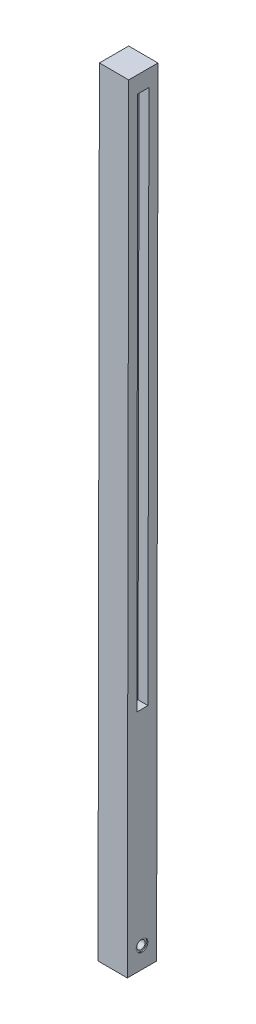
ISO-10303-21;
HEADER;
FILE_DESCRIPTION(('STEP AP214'),'2;1');
FILE_NAME('part.step','',(''),(''),'','','');
FILE_SCHEMA(('AUTOMOTIVE_DESIGN { 1 0 10303 214 1 1 1 1 }'));
ENDSEC;
DATA;
#1=APPLICATION_CONTEXT('core data for automotive mechanical design processes');
#2=APPLICATION_PROTOCOL_DEFINITION('international standard','automotive_design',2000,#1);
#3=PRODUCT_CONTEXT('',#1,'mechanical');
#4=PRODUCT('Part','Part','',(#3));
#5=PRODUCT_RELATED_PRODUCT_CATEGORY('part','',(#4));
#6=PRODUCT_DEFINITION_FORMATION('','',#4);
#7=PRODUCT_DEFINITION_CONTEXT('part definition',#1,'design');
#8=PRODUCT_DEFINITION('design','',#6,#7);
#9=PRODUCT_DEFINITION_SHAPE('','',#8);
#10=(LENGTH_UNIT() NAMED_UNIT(*) SI_UNIT(.MILLI.,.METRE.));
#11=(NAMED_UNIT(*) PLANE_ANGLE_UNIT() SI_UNIT($,.RADIAN.));
#12=(NAMED_UNIT(*) SI_UNIT($,.STERADIAN.) SOLID_ANGLE_UNIT());
#13=UNCERTAINTY_MEASURE_WITH_UNIT(LENGTH_MEASURE(1.E-05),#10,'distance_accuracy_value','');
#14=(GEOMETRIC_REPRESENTATION_CONTEXT(3) GLOBAL_UNCERTAINTY_ASSIGNED_CONTEXT((#13)) GLOBAL_UNIT_ASSIGNED_CONTEXT((#10,
#11,#12)) REPRESENTATION_CONTEXT('',''));
#15=CARTESIAN_POINT('',(0.,0.,0.));
#16=DIRECTION('',(0.,0.,1.));
#17=DIRECTION('',(1.,0.,0.));
#18=AXIS2_PLACEMENT_3D('',#15,#16,#17);
#19=CARTESIAN_POINT('',(24.3417149604156,31.7075640077742,0.));
#20=DIRECTION('',(-0.999998476913288,0.0017453283659014,0.));
#21=DIRECTION('',(-0.0017453283659014,-0.999998476913288,0.));
#22=AXIS2_PLACEMENT_3D('',#19,#20,#21);
#23=CYLINDRICAL_SURFACE('',#22,6.4135);
#24=CARTESIAN_POINT('',(-20.5820543916748,31.785970856148,0.));
#25=DIRECTION('',(-0.999998476913288,0.00174532836589819,0.));
#26=DIRECTION('',(-0.00174532836589819,-0.999998476913288,0.));
#27=AXIS2_PLACEMENT_3D('',#24,#25,#26);
#28=CIRCLE('',#27,6.4135);
#29=CARTESIAN_POINT('',(-20.5932480551494,25.3724806244647,0.));
#30=VERTEX_POINT('',#29);
#31=EDGE_CURVE('E165',#30,#30,#28,.T.);
#32=CARTESIAN_POINT('',(20.6928827429093,31.7139324278455,0.));
#33=DIRECTION('',(0.999998476913288,-0.0017453283658982,0.));
#34=DIRECTION('',(0.0017453283658982,0.999998476913288,0.));
#35=AXIS2_PLACEMENT_3D('',#32,#33,#34);
#36=CIRCLE('',#35,6.4135);
#37=CARTESIAN_POINT('',(20.6816890794346,25.3004421961621,0.));
#38=VERTEX_POINT('',#37);
#39=EDGE_CURVE('E43',#38,#38,#36,.T.);
#40=CARTESIAN_POINT('',(-20.5932480551494,25.3724806244647,0.));
#41=CARTESIAN_POINT('',(-20.1633007933309,25.3717302241698,0.));
#42=CARTESIAN_POINT('',(-19.7333535315123,25.370979823875,0.));
#43=CARTESIAN_POINT('',(-18.8734590078751,25.3694790232854,0.));
#44=CARTESIAN_POINT('',(-18.4435117460565,25.3687286229906,0.));
#45=CARTESIAN_POINT('',(-17.5836172224194,25.3672278224009,0.));
#46=CARTESIAN_POINT('',(-17.1536699606008,25.3664774221061,0.));
#47=CARTESIAN_POINT('',(-16.2937754369636,25.3649766215165,0.));
#48=CARTESIAN_POINT('',(-15.863828175145,25.3642262212216,0.));
#49=CARTESIAN_POINT('',(-15.0039336515079,25.362725420632,0.));
#50=CARTESIAN_POINT('',(-14.5739863896893,25.3619750203372,0.));
#51=CARTESIAN_POINT('',(-13.7140918660521,25.3604742197476,0.));
#52=CARTESIAN_POINT('',(-13.2841446042335,25.3597238194527,0.));
#53=CARTESIAN_POINT('',(-12.4242500805964,25.3582230188631,0.));
#54=CARTESIAN_POINT('',(-11.9943028187778,25.3574726185683,0.));
#55=CARTESIAN_POINT('',(-11.1344082951406,25.3559718179786,0.));
#56=CARTESIAN_POINT('',(-10.704461033322,25.3552214176838,0.));
#57=CARTESIAN_POINT('',(-9.84456650968485,25.3537206170942,0.));
#58=CARTESIAN_POINT('',(-9.41461924786627,25.3529702167994,0.));
#59=CARTESIAN_POINT('',(-8.5547247242291,25.3514694162097,0.));
#60=CARTESIAN_POINT('',(-8.12477746241052,25.3507190159149,0.));
#61=CARTESIAN_POINT('',(-7.26488293877335,25.3492182153253,0.));
#62=CARTESIAN_POINT('',(-6.83493567695476,25.3484678150305,0.));
#63=CARTESIAN_POINT('',(-5.9750411533176,25.3469670144408,0.));
#64=CARTESIAN_POINT('',(-5.54509389149901,25.346216614146,0.));
#65=CARTESIAN_POINT('',(-4.68519936786185,25.3447158135564,0.));
#66=CARTESIAN_POINT('',(-4.25525210604326,25.3439654132616,0.));
#67=CARTESIAN_POINT('',(-3.39535758240609,25.3424646126719,0.));
#68=CARTESIAN_POINT('',(-2.96541032058751,25.3417142123771,0.));
#69=CARTESIAN_POINT('',(-2.10551579695034,25.3402134117875,0.));
#70=CARTESIAN_POINT('',(-1.67556853513176,25.3394630114926,0.));
#71=CARTESIAN_POINT('',(-0.815674011494589,25.337962210903,0.));
#72=CARTESIAN_POINT('',(-0.385726749676005,25.3372118106082,0.));
#73=CARTESIAN_POINT('',(0.474167773961162,25.3357110100186,0.));
#74=CARTESIAN_POINT('',(0.904115035779745,25.3349606097237,0.));
#75=CARTESIAN_POINT('',(1.76400955941691,25.3334598091341,0.));
#76=CARTESIAN_POINT('',(2.1939568212355,25.3327094088393,0.));
#77=CARTESIAN_POINT('',(3.05385134487267,25.3312086082496,0.));
#78=CARTESIAN_POINT('',(3.48379860669125,25.3304582079548,0.));
#79=CARTESIAN_POINT('',(4.34369313032842,25.3289574073652,0.));
#80=CARTESIAN_POINT('',(4.773640392147,25.3282070070704,0.));
#81=CARTESIAN_POINT('',(5.63353491578417,25.3267062064807,0.));
#82=CARTESIAN_POINT('',(6.06348217760276,25.3259558061859,0.));
#83=CARTESIAN_POINT('',(6.92337670123992,25.3244550055963,0.));
#84=CARTESIAN_POINT('',(7.3533239630585,25.3237046053015,0.));
#85=CARTESIAN_POINT('',(8.21321848669567,25.3222038047118,0.));
#86=CARTESIAN_POINT('',(8.64316574851426,25.321453404417,0.));
#87=CARTESIAN_POINT('',(9.50306027215143,25.3199526038274,0.));
#88=CARTESIAN_POINT('',(9.93300753397001,25.3192022035326,0.));
#89=CARTESIAN_POINT('',(10.7929020576072,25.3177014029429,0.));
#90=CARTESIAN_POINT('',(11.2228493194258,25.3169510026481,0.));
#91=CARTESIAN_POINT('',(12.0827438430629,25.3154502020585,0.));
#92=CARTESIAN_POINT('',(12.5126911048815,25.3146998017636,0.));
#93=CARTESIAN_POINT('',(13.3725856285187,25.313199001174,0.));
#94=CARTESIAN_POINT('',(13.8025328903373,25.3124486008792,0.));
#95=CARTESIAN_POINT('',(14.6624274139744,25.3109478002895,0.));
#96=CARTESIAN_POINT('',(15.092374675793,25.3101973999947,0.));
#97=CARTESIAN_POINT('',(15.9522691994302,25.3086965994051,0.));
#98=CARTESIAN_POINT('',(16.3822164612488,25.3079461991103,0.));
#99=CARTESIAN_POINT('',(17.2421109848859,25.3064453985206,0.));
#100=CARTESIAN_POINT('',(17.6720582467045,25.3056949982258,0.));
#101=CARTESIAN_POINT('',(18.5319527703417,25.3041941976362,0.));
#102=CARTESIAN_POINT('',(18.9619000321603,25.3034437973414,0.));
#103=CARTESIAN_POINT('',(19.8217945557974,25.3019429967517,0.));
#104=CARTESIAN_POINT('',(20.251741817616,25.3011925964569,0.));
#105=CARTESIAN_POINT('',(20.6816890794346,25.3004421961621,0.));
#106=B_SPLINE_CURVE_WITH_KNOTS('',3,(#40,#41,#42,#43,#44,#45,#46,#47,#48,#49,#50,#51,#52,#53,
#54,#55,#56,#57,#58,#59,#60,#61,#62,#63,#64,#65,#66,#67,#68,#69,#70,#71,#72,#73,#74,#75,#76,#77,
#78,#79,#80,#81,#82,#83,#84,#85,#86,#87,#88,#89,#90,#91,#92,#93,#94,#95,#96,#97,#98,#99,#100,
#101,#102,#103,#104,#105),.UNSPECIFIED.,.F.,.F.,(4,2,2,2,2,2,2,2,2,2,2,2,2,2,2,2,2,2,2,2,2,2,2,
2,2,2,2,2,2,2,2,2,4),(0.,1.28984374999963,2.57968749999925,3.86953124999888,5.15937499999852,
6.44921874999813,7.73906249999777,9.0289062499974,10.318749999997,11.6085937499967,
12.8984374999963,14.1882812499959,15.4781249999955,16.7679687499952,18.0578124999948,
19.3476562499944,20.6374999999941,21.9273437499937,23.2171874999933,24.5070312499929,
25.7968749999926,27.0867187499922,28.3765624999918,29.6664062499914,30.9562499999911,
32.2460937499907,33.5359374999903,34.82578124999,36.1156249999896,37.4054687499892,
38.6953124999888,39.9851562499885,41.2749999999881),.UNSPECIFIED.);
#107=EDGE_CURVE('BSEAM39',#30,#38,#106,.T.);
#108=ORIENTED_EDGE('',*,*,#31,.T.);
#109=ORIENTED_EDGE('',*,*,#39,.T.);
#110=ORIENTED_EDGE('',*,*,#107,.T.);
#111=ORIENTED_EDGE('',*,*,#107,.F.);
#112=EDGE_LOOP('',(#108,#110,#109,#111));
#113=FACE_BOUND('',#112,.T.);
#114=ADVANCED_FACE('F39',(#113),#23,.F.);
#115=CARTESIAN_POINT('',(22.2249661493979,-0.0387899229321587,22.225));
#116=DIRECTION('',(-0.999998476913288,0.00174532836589819,0.));
#117=DIRECTION('',(-0.00174532836589819,-0.999998476913288,0.));
#118=AXIS2_PLACEMENT_3D('',#115,#116,#117);
#119=PLANE('',#118);
#120=CARTESIAN_POINT('',(22.2803803250091,31.7111617190647,0.));
#121=DIRECTION('',(-0.999998476913288,0.0017453283658982,0.));
#122=DIRECTION('',(-0.0017453283658982,-0.999998476913288,0.));
#123=AXIS2_PLACEMENT_3D('',#120,#121,#122);
#124=CIRCLE('',#123,8.89);
#125=CARTESIAN_POINT('',(22.2648643558363,22.8211752593056,0.));
#126=VERTEX_POINT('',#125);
#127=EDGE_CURVE('E177',#126,#126,#124,.T.);
#128=ORIENTED_EDGE('',*,*,#127,.T.);
#129=EDGE_LOOP('',(#128));
#130=FACE_BOUND('',#129,.T.);
#131=DIRECTION('',(0.00174532836589819,0.999998476913288,0.));
#132=VECTOR('',#131,1.);
#133=CARTESIAN_POINT('',(22.8233728276994,342.822632929349,-8.4963));
#134=LINE('',#133,#132);
#135=CARTESIAN_POINT('',(22.8233728276994,342.822632929349,-8.4963));
#136=VERTEX_POINT('',#135);
#137=CARTESIAN_POINT('',(24.2419757235015,1155.62139496447,-8.4963));
#138=VERTEX_POINT('',#137);
#139=EDGE_CURVE('E57',#136,#138,#134,.T.);
#140=ORIENTED_EDGE('',*,*,#139,.F.);
#141=DIRECTION('',(0.,0.,1.));
#142=VECTOR('',#141,1.);
#143=CARTESIAN_POINT('',(22.8233728276994,342.822632929349,8.4963));
#144=LINE('',#143,#142);
#145=CARTESIAN_POINT('',(22.8233728276994,342.822632929349,8.4963));
#146=VERTEX_POINT('',#145);
#147=EDGE_CURVE('E182',#136,#146,#144,.T.);
#148=ORIENTED_EDGE('',*,*,#147,.T.);
#149=DIRECTION('',(0.00174532836589819,0.999998476913288,0.));
#150=VECTOR('',#149,1.);
#151=CARTESIAN_POINT('',(22.8233728276994,342.822632929349,8.4963));
#152=LINE('',#151,#150);
#153=CARTESIAN_POINT('',(24.2419757235015,1155.62139496447,8.4963));
#154=VERTEX_POINT('',#153);
#155=EDGE_CURVE('E132',#146,#154,#152,.T.);
#156=ORIENTED_EDGE('',*,*,#155,.T.);
#157=DIRECTION('',(0.,0.,1.));
#158=VECTOR('',#157,1.);
#159=CARTESIAN_POINT('',(24.2419757235015,1155.62139496447,8.4963));
#160=LINE('',#159,#158);
#161=EDGE_CURVE('E138',#138,#154,#160,.T.);
#162=ORIENTED_EDGE('',*,*,#161,.F.);
#163=EDGE_LOOP('',(#140,#148,#156,#162));
#164=FACE_BOUND('',#163,.T.);
#165=DIRECTION('',(0.,0.,1.));
#166=VECTOR('',#165,1.);
#167=CARTESIAN_POINT('',(24.2863070639953,1181.02135627807,22.225));
#168=LINE('',#167,#166);
#169=CARTESIAN_POINT('',(24.2863070639953,1181.02135627807,-22.225));
#170=VERTEX_POINT('',#169);
#171=CARTESIAN_POINT('',(24.2863070639953,1181.02135627807,22.225));
#172=VERTEX_POINT('',#171);
#173=EDGE_CURVE('E136',#170,#172,#168,.T.);
#174=ORIENTED_EDGE('',*,*,#173,.T.);
#175=DIRECTION('',(0.00174532836589819,0.999998476913288,0.));
#176=VECTOR('',#175,1.);
#177=CARTESIAN_POINT('',(22.2249661493979,-0.0387899229321587,22.225));
#178=LINE('',#177,#176);
#179=CARTESIAN_POINT('',(22.2249661493979,-0.0387899229321587,22.225));
#180=VERTEX_POINT('',#179);
#181=EDGE_CURVE('E11',#180,#172,#178,.T.);
#182=ORIENTED_EDGE('',*,*,#181,.F.);
#183=DIRECTION('',(0.,0.,1.));
#184=VECTOR('',#183,1.);
#185=CARTESIAN_POINT('',(22.2249661493979,-0.0387899229321587,22.225));
#186=LINE('',#185,#184);
#187=CARTESIAN_POINT('',(22.2249661493979,-0.0387899229321587,-22.225));
#188=VERTEX_POINT('',#187);
#189=EDGE_CURVE('E146',#188,#180,#186,.T.);
#190=ORIENTED_EDGE('',*,*,#189,.F.);
#191=DIRECTION('',(0.00174532836589819,0.999998476913288,0.));
#192=VECTOR('',#191,1.);
#193=CARTESIAN_POINT('',(22.2249661493979,-0.0387899229321587,-22.225));
#194=LINE('',#193,#192);
#195=EDGE_CURVE('E153',#188,#170,#194,.T.);
#196=ORIENTED_EDGE('',*,*,#195,.T.);
#197=EDGE_LOOP('',(#174,#182,#190,#196));
#198=FACE_BOUND('',#197,.T.);
#199=ADVANCED_FACE('F41',(#130,#164,#198),#119,.F.);
#200=CARTESIAN_POINT('',(-22.2249661493919,0.0387899229321587,22.225));
#201=DIRECTION('',(0.,0.,-1.));
#202=DIRECTION('',(-1.,0.,0.));
#203=AXIS2_PLACEMENT_3D('',#200,#201,#202);
#204=PLANE('',#203);
#205=DIRECTION('',(-0.999998476913288,0.00174532836590163,0.));
#206=VECTOR('',#205,1.);
#207=CARTESIAN_POINT('',(-20.1636252347944,1181.09893612393,22.225));
#208=LINE('',#207,#206);
#209=CARTESIAN_POINT('',(-20.1636252347944,1181.09893612393,22.225));
#210=VERTEX_POINT('',#209);
#211=EDGE_CURVE('E144',#172,#210,#208,.T.);
#212=ORIENTED_EDGE('',*,*,#211,.T.);
#213=DIRECTION('',(0.00174532836589819,0.999998476913288,0.));
#214=VECTOR('',#213,1.);
#215=CARTESIAN_POINT('',(-22.2249661493919,0.0387899229321587,22.225));
#216=LINE('',#215,#214);
#217=CARTESIAN_POINT('',(-22.2249661493919,0.0387899229321587,22.225));
#218=VERTEX_POINT('',#217);
#219=EDGE_CURVE('E48',#218,#210,#216,.T.);
#220=ORIENTED_EDGE('',*,*,#219,.F.);
#221=DIRECTION('',(-0.999998476913288,0.00174532836590163,0.));
#222=VECTOR('',#221,1.);
#223=CARTESIAN_POINT('',(-22.2249661493919,0.0387899229321587,22.225));
#224=LINE('',#223,#222);
#225=EDGE_CURVE('E92',#180,#218,#224,.T.);
#226=ORIENTED_EDGE('',*,*,#225,.F.);
#227=ORIENTED_EDGE('',*,*,#181,.T.);
#228=EDGE_LOOP('',(#212,#220,#226,#227));
#229=FACE_BOUND('',#228,.T.);
#230=ADVANCED_FACE('F208',(#229),#204,.F.);
#231=CARTESIAN_POINT('',(-22.2249661493919,0.0387899229321587,22.225));
#232=DIRECTION('',(0.999998476913288,-0.00174532836589819,0.));
#233=DIRECTION('',(0.00174532836589819,0.999998476913288,0.));
#234=AXIS2_PLACEMENT_3D('',#231,#232,#233);
#235=PLANE('',#234);
#236=CARTESIAN_POINT('',(-22.1695519737746,31.7887415649289,0.));
#237=DIRECTION('',(-0.999998476913288,0.00174532836589819,0.));
#238=DIRECTION('',(-0.00174532836589819,-0.999998476913288,0.));
#239=AXIS2_PLACEMENT_3D('',#236,#237,#238);
#240=CIRCLE('',#239,8.89);
#241=CARTESIAN_POINT('',(-22.1850679429474,22.8987551051698,0.));
#242=VERTEX_POINT('',#241);
#243=EDGE_CURVE('E175',#242,#242,#240,.T.);
#244=ORIENTED_EDGE('',*,*,#243,.F.);
#245=EDGE_LOOP('',(#244));
#246=FACE_BOUND('',#245,.T.);
#247=DIRECTION('',(0.,0.,-1.));
#248=VECTOR('',#247,1.);
#249=CARTESIAN_POINT('',(-20.1636252347944,1181.09893612393,22.225));
#250=LINE('',#249,#248);
#251=CARTESIAN_POINT('',(-20.1636252347944,1181.09893612393,-22.225));
#252=VERTEX_POINT('',#251);
#253=EDGE_CURVE('E159',#210,#252,#250,.T.);
#254=ORIENTED_EDGE('',*,*,#253,.T.);
#255=DIRECTION('',(0.00174532836589819,0.999998476913288,0.));
#256=VECTOR('',#255,1.);
#257=CARTESIAN_POINT('',(-22.2249661493919,0.0387899229321587,-22.225));
#258=LINE('',#257,#256);
#259=CARTESIAN_POINT('',(-22.2249661493919,0.0387899229321587,-22.225));
#260=VERTEX_POINT('',#259);
#261=EDGE_CURVE('E163',#260,#252,#258,.T.);
#262=ORIENTED_EDGE('',*,*,#261,.F.);
#263=DIRECTION('',(0.,0.,-1.));
#264=VECTOR('',#263,1.);
#265=CARTESIAN_POINT('',(-22.2249661493919,0.0387899229321587,22.225));
#266=LINE('',#265,#264);
#267=EDGE_CURVE('E151',#218,#260,#266,.T.);
#268=ORIENTED_EDGE('',*,*,#267,.F.);
#269=ORIENTED_EDGE('',*,*,#219,.T.);
#270=EDGE_LOOP('',(#254,#262,#268,#269));
#271=FACE_BOUND('',#270,.T.);
#272=ADVANCED_FACE('F229',(#246,#271),#235,.F.);
#273=CARTESIAN_POINT('',(-22.2249661493919,0.0387899229321587,-22.225));
#274=DIRECTION('',(0.,0.,1.));
#275=DIRECTION('',(1.,0.,0.));
#276=AXIS2_PLACEMENT_3D('',#273,#274,#275);
#277=PLANE('',#276);
#278=DIRECTION('',(0.999998476913288,-0.00174532836590163,0.));
#279=VECTOR('',#278,1.);
#280=CARTESIAN_POINT('',(-20.1636252347944,1181.09893612393,-22.225));
#281=LINE('',#280,#279);
#282=EDGE_CURVE('E89',#252,#170,#281,.T.);
#283=ORIENTED_EDGE('',*,*,#282,.T.);
#284=ORIENTED_EDGE('',*,*,#195,.F.);
#285=DIRECTION('',(0.999998476913288,-0.00174532836590163,0.));
#286=VECTOR('',#285,1.);
#287=CARTESIAN_POINT('',(-22.2249661493919,0.0387899229321587,-22.225));
#288=LINE('',#287,#286);
#289=EDGE_CURVE('E63',#260,#188,#288,.T.);
#290=ORIENTED_EDGE('',*,*,#289,.F.);
#291=ORIENTED_EDGE('',*,*,#261,.T.);
#292=EDGE_LOOP('',(#283,#284,#290,#291));
#293=FACE_BOUND('',#292,.T.);
#294=ADVANCED_FACE('F235',(#293),#277,.F.);
#295=CARTESIAN_POINT('',(4.0614213381307E-12,2.22044604925031E-13,0.));
#296=DIRECTION('',(-0.00174532836590163,-0.999998476913288,0.));
#297=DIRECTION('',(0.999998476913288,-0.00174532836590163,0.));
#298=AXIS2_PLACEMENT_3D('',#295,#296,#297);
#299=PLANE('',#298);
#300=ORIENTED_EDGE('',*,*,#189,.T.);
#301=ORIENTED_EDGE('',*,*,#225,.T.);
#302=ORIENTED_EDGE('',*,*,#267,.T.);
#303=ORIENTED_EDGE('',*,*,#289,.T.);
#304=EDGE_LOOP('',(#300,#301,#302,#303));
#305=FACE_BOUND('',#304,.T.);
#306=ADVANCED_FACE('F245',(#305),#299,.T.);
#307=CARTESIAN_POINT('',(2.06134091460149,1181.060146201,0.));
#308=DIRECTION('',(-0.00174532836590163,-0.999998476913288,0.));
#309=DIRECTION('',(0.999998476913288,-0.00174532836590163,0.));
#310=AXIS2_PLACEMENT_3D('',#307,#308,#309);
#311=PLANE('',#310);
#312=ORIENTED_EDGE('',*,*,#173,.F.);
#313=ORIENTED_EDGE('',*,*,#282,.F.);
#314=ORIENTED_EDGE('',*,*,#253,.F.);
#315=ORIENTED_EDGE('',*,*,#211,.F.);
#316=EDGE_LOOP('',(#312,#313,#314,#315));
#317=FACE_BOUND('',#316,.T.);
#318=ADVANCED_FACE('F237',(#317),#311,.F.);
#319=CARTESIAN_POINT('',(22.8233728276994,342.822632929349,8.4963));
#320=DIRECTION('',(0.,0.,-1.));
#321=DIRECTION('',(-1.,0.,0.));
#322=AXIS2_PLACEMENT_3D('',#319,#320,#321);
#323=PLANE('',#322);
#324=DIRECTION('',(-0.999998476913288,0.00174532836590549,0.));
#325=VECTOR('',#324,1.);
#326=CARTESIAN_POINT('',(24.2419757235015,1155.62139496447,8.4963));
#327=LINE('',#326,#325);
#328=CARTESIAN_POINT('',(9.23059858716536,1155.6475947867,8.4963));
#329=VERTEX_POINT('',#328);
#330=EDGE_CURVE('E168',#154,#329,#327,.T.);
#331=ORIENTED_EDGE('',*,*,#330,.F.);
#332=ORIENTED_EDGE('',*,*,#155,.F.);
#333=DIRECTION('',(-0.999998476913288,0.00174532836590549,0.));
#334=VECTOR('',#333,1.);
#335=CARTESIAN_POINT('',(22.8233728276994,342.822632929349,8.4963));
#336=LINE('',#335,#334);
#337=CARTESIAN_POINT('',(7.81199569136331,342.848832751581,8.4963));
#338=VERTEX_POINT('',#337);
#339=EDGE_CURVE('E119',#146,#338,#336,.T.);
#340=ORIENTED_EDGE('',*,*,#339,.T.);
#341=DIRECTION('',(0.00174532836589819,0.999998476913288,0.));
#342=VECTOR('',#341,1.);
#343=CARTESIAN_POINT('',(7.81199569136331,342.848832751581,8.4963));
#344=LINE('',#343,#342);
#345=EDGE_CURVE('E131',#338,#329,#344,.T.);
#346=ORIENTED_EDGE('',*,*,#345,.T.);
#347=EDGE_LOOP('',(#331,#332,#340,#346));
#348=FACE_BOUND('',#347,.T.);
#349=ADVANCED_FACE('F134',(#348),#323,.T.);
#350=CARTESIAN_POINT('',(7.81199569136331,342.848832751581,8.4963));
#351=DIRECTION('',(0.999998476913288,-0.00174532836589819,0.));
#352=DIRECTION('',(0.00174532836589819,0.999998476913288,0.));
#353=AXIS2_PLACEMENT_3D('',#350,#351,#352);
#354=PLANE('',#353);
#355=DIRECTION('',(0.,0.,-1.));
#356=VECTOR('',#355,1.);
#357=CARTESIAN_POINT('',(9.23059858716536,1155.6475947867,8.4963));
#358=LINE('',#357,#356);
#359=CARTESIAN_POINT('',(9.23059858716536,1155.6475947867,-8.4963));
#360=VERTEX_POINT('',#359);
#361=EDGE_CURVE('E140',#329,#360,#358,.T.);
#362=ORIENTED_EDGE('',*,*,#361,.F.);
#363=ORIENTED_EDGE('',*,*,#345,.F.);
#364=DIRECTION('',(0.,0.,-1.));
#365=VECTOR('',#364,1.);
#366=CARTESIAN_POINT('',(7.81199569136331,342.848832751581,8.4963));
#367=LINE('',#366,#365);
#368=CARTESIAN_POINT('',(7.81199569136331,342.848832751581,-8.4963));
#369=VERTEX_POINT('',#368);
#370=EDGE_CURVE('E116',#338,#369,#367,.T.);
#371=ORIENTED_EDGE('',*,*,#370,.T.);
#372=DIRECTION('',(0.00174532836589819,0.999998476913288,0.));
#373=VECTOR('',#372,1.);
#374=CARTESIAN_POINT('',(7.81199569136331,342.848832751581,-8.4963));
#375=LINE('',#374,#373);
#376=EDGE_CURVE('E142',#369,#360,#375,.T.);
#377=ORIENTED_EDGE('',*,*,#376,.T.);
#378=EDGE_LOOP('',(#362,#363,#371,#377));
#379=FACE_BOUND('',#378,.T.);
#380=ADVANCED_FACE('F137',(#379),#354,.T.);
#381=CARTESIAN_POINT('',(22.8233728276994,342.822632929349,-8.4963));
#382=DIRECTION('',(0.,0.,1.));
#383=DIRECTION('',(1.,0.,0.));
#384=AXIS2_PLACEMENT_3D('',#381,#382,#383);
#385=PLANE('',#384);
#386=DIRECTION('',(0.999998476913288,-0.00174532836590549,0.));
#387=VECTOR('',#386,1.);
#388=CARTESIAN_POINT('',(24.2419757235015,1155.62139496447,-8.4963));
#389=LINE('',#388,#387);
#390=EDGE_CURVE('E187',#360,#138,#389,.T.);
#391=ORIENTED_EDGE('',*,*,#390,.F.);
#392=ORIENTED_EDGE('',*,*,#376,.F.);
#393=DIRECTION('',(0.999998476913288,-0.00174532836590549,0.));
#394=VECTOR('',#393,1.);
#395=CARTESIAN_POINT('',(22.8233728276994,342.822632929349,-8.4963));
#396=LINE('',#395,#394);
#397=EDGE_CURVE('E125',#369,#136,#396,.T.);
#398=ORIENTED_EDGE('',*,*,#397,.T.);
#399=ORIENTED_EDGE('',*,*,#139,.T.);
#400=EDGE_LOOP('',(#391,#392,#398,#399));
#401=FACE_BOUND('',#400,.T.);
#402=ADVANCED_FACE('F191',(#401),#385,.T.);
#403=CARTESIAN_POINT('',(0.598406678310184,342.861422852282,0.));
#404=DIRECTION('',(-0.00174532836590549,-0.999998476913288,0.));
#405=DIRECTION('',(0.999998476913288,-0.00174532836590549,0.));
#406=AXIS2_PLACEMENT_3D('',#403,#404,#405);
#407=PLANE('',#406);
#408=ORIENTED_EDGE('',*,*,#339,.F.);
#409=ORIENTED_EDGE('',*,*,#147,.F.);
#410=ORIENTED_EDGE('',*,*,#397,.F.);
#411=ORIENTED_EDGE('',*,*,#370,.F.);
#412=EDGE_LOOP('',(#408,#409,#410,#411));
#413=FACE_BOUND('',#412,.T.);
#414=ADVANCED_FACE('F117',(#413),#407,.F.);
#415=CARTESIAN_POINT('',(2.01700957411224,1155.6601848874,0.));
#416=DIRECTION('',(-0.00174532836590549,-0.999998476913288,0.));
#417=DIRECTION('',(0.999998476913288,-0.00174532836590549,0.));
#418=AXIS2_PLACEMENT_3D('',#415,#416,#417);
#419=PLANE('',#418);
#420=ORIENTED_EDGE('',*,*,#330,.T.);
#421=ORIENTED_EDGE('',*,*,#361,.T.);
#422=ORIENTED_EDGE('',*,*,#390,.T.);
#423=ORIENTED_EDGE('',*,*,#161,.T.);
#424=EDGE_LOOP('',(#420,#421,#422,#423));
#425=FACE_BOUND('',#424,.T.);
#426=ADVANCED_FACE('F195',(#425),#419,.T.);
#427=CARTESIAN_POINT('',(-20.5820543916748,31.785970856148,0.));
#428=DIRECTION('',(-0.999998476913288,0.00174532836589819,0.));
#429=DIRECTION('',(-0.00174532836589819,-0.999998476913288,0.));
#430=AXIS2_PLACEMENT_3D('',#427,#428,#429);
#431=CYLINDRICAL_SURFACE('',#430,8.89);
#432=CARTESIAN_POINT('',(-20.5820543916748,31.785970856148,0.));
#433=DIRECTION('',(-0.999998476913288,0.00174532836589819,0.));
#434=DIRECTION('',(-0.00174532836589819,-0.999998476913288,0.));
#435=AXIS2_PLACEMENT_3D('',#432,#433,#434);
#436=CIRCLE('',#435,8.89);
#437=CARTESIAN_POINT('',(-20.5975703608476,22.8959843963889,0.));
#438=VERTEX_POINT('',#437);
#439=EDGE_CURVE('E170',#438,#438,#436,.T.);
#440=ORIENTED_EDGE('',*,*,#439,.F.);
#441=EDGE_LOOP('',(#440));
#442=FACE_BOUND('',#441,.T.);
#443=ORIENTED_EDGE('',*,*,#243,.T.);
#444=EDGE_LOOP('',(#443));
#445=FACE_BOUND('',#444,.T.);
#446=ADVANCED_FACE('F211',(#442,#445),#431,.F.);
#447=CARTESIAN_POINT('',(-20.5820543916748,31.785970856148,0.));
#448=DIRECTION('',(-0.999998476913288,0.00174532836589819,0.));
#449=DIRECTION('',(-0.00174532836589819,-0.999998476913288,0.));
#450=AXIS2_PLACEMENT_3D('',#447,#448,#449);
#451=PLANE('',#450);
#452=ORIENTED_EDGE('',*,*,#31,.F.);
#453=EDGE_LOOP('',(#452));
#454=FACE_BOUND('',#453,.T.);
#455=ORIENTED_EDGE('',*,*,#439,.T.);
#456=EDGE_LOOP('',(#455));
#457=FACE_BOUND('',#456,.T.);
#458=ADVANCED_FACE('F223',(#454,#457),#451,.T.);
#459=CARTESIAN_POINT('',(20.6928827429093,31.7139324278456,0.));
#460=DIRECTION('',(0.999998476913288,-0.0017453283658982,0.));
#461=DIRECTION('',(0.0017453283658982,0.999998476913288,0.));
#462=AXIS2_PLACEMENT_3D('',#459,#460,#461);
#463=CYLINDRICAL_SURFACE('',#462,8.89);
#464=CARTESIAN_POINT('',(20.6928827429093,31.7139324278456,0.));
#465=DIRECTION('',(-0.999998476913288,0.0017453283658982,0.));
#466=DIRECTION('',(-0.0017453283658982,-0.999998476913288,0.));
#467=AXIS2_PLACEMENT_3D('',#464,#465,#466);
#468=CIRCLE('',#467,8.89);
#469=CARTESIAN_POINT('',(20.6773667737365,22.8239459680865,0.));
#470=VERTEX_POINT('',#469);
#471=EDGE_CURVE('E316',#470,#470,#468,.T.);
#472=ORIENTED_EDGE('',*,*,#471,.T.);
#473=EDGE_LOOP('',(#472));
#474=FACE_BOUND('',#473,.T.);
#475=ORIENTED_EDGE('',*,*,#127,.F.);
#476=EDGE_LOOP('',(#475));
#477=FACE_BOUND('',#476,.T.);
#478=ADVANCED_FACE('F221',(#474,#477),#463,.F.);
#479=CARTESIAN_POINT('',(20.6928827429093,31.7139324278456,0.));
#480=DIRECTION('',(0.999998476913288,-0.0017453283658982,0.));
#481=DIRECTION('',(-0.0017453283658982,-0.999998476913288,0.));
#482=AXIS2_PLACEMENT_3D('',#479,#480,#481);
#483=PLANE('',#482);
#484=ORIENTED_EDGE('',*,*,#39,.F.);
#485=EDGE_LOOP('',(#484));
#486=FACE_BOUND('',#485,.T.);
#487=ORIENTED_EDGE('',*,*,#471,.F.);
#488=EDGE_LOOP('',(#487));
#489=FACE_BOUND('',#488,.T.);
#490=ADVANCED_FACE('F301',(#486,#489),#483,.T.);
#491=CLOSED_SHELL('',(#114,#199,#230,#272,#294,#306,#318,#349,#380,#402,#414,#426,#446,#458,
#478,#490));
#492=MANIFOLD_SOLID_BREP('B2',#491);
#493=ADVANCED_BREP_SHAPE_REPRESENTATION('',(#18,#492),#14);
#494=SHAPE_DEFINITION_REPRESENTATION(#9,#493);
ENDSEC;
END-ISO-10303-21;
